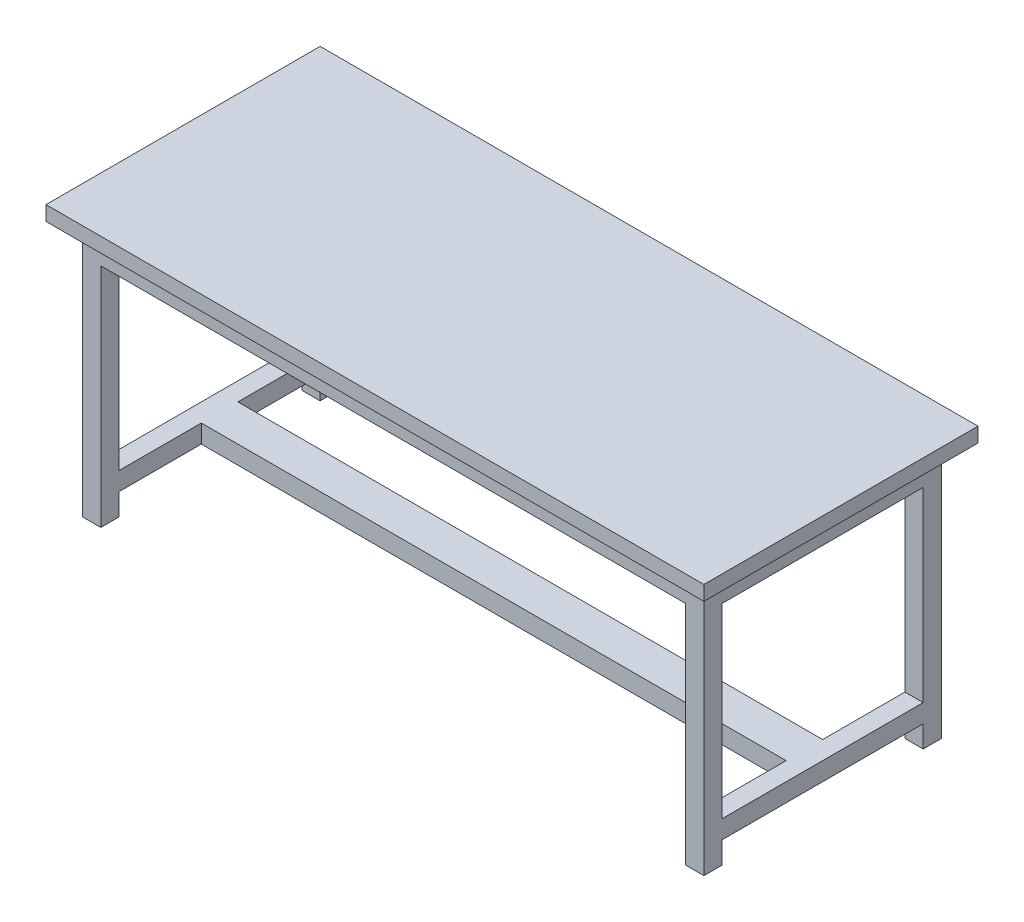
ISO-10303-21;
HEADER;
FILE_DESCRIPTION(('STEP AP214'),'2;1');
FILE_NAME('part.step','',(''),(''),'','','');
FILE_SCHEMA(('AUTOMOTIVE_DESIGN { 1 0 10303 214 1 1 1 1 }'));
ENDSEC;
DATA;
#1=APPLICATION_CONTEXT('core data for automotive mechanical design processes');
#2=APPLICATION_PROTOCOL_DEFINITION('international standard','automotive_design',2000,#1);
#3=PRODUCT_CONTEXT('',#1,'mechanical');
#4=PRODUCT('Part','Part','',(#3));
#5=PRODUCT_RELATED_PRODUCT_CATEGORY('part','',(#4));
#6=PRODUCT_DEFINITION_FORMATION('','',#4);
#7=PRODUCT_DEFINITION_CONTEXT('part definition',#1,'design');
#8=PRODUCT_DEFINITION('design','',#6,#7);
#9=PRODUCT_DEFINITION_SHAPE('','',#8);
#10=(LENGTH_UNIT() NAMED_UNIT(*) SI_UNIT(.MILLI.,.METRE.));
#11=(NAMED_UNIT(*) PLANE_ANGLE_UNIT() SI_UNIT($,.RADIAN.));
#12=(NAMED_UNIT(*) SI_UNIT($,.STERADIAN.) SOLID_ANGLE_UNIT());
#13=UNCERTAINTY_MEASURE_WITH_UNIT(LENGTH_MEASURE(1.E-05),#10,'distance_accuracy_value','');
#14=(GEOMETRIC_REPRESENTATION_CONTEXT(3) GLOBAL_UNCERTAINTY_ASSIGNED_CONTEXT((#13)) GLOBAL_UNIT_ASSIGNED_CONTEXT((#10,
#11,#12)) REPRESENTATION_CONTEXT('',''));
#15=CARTESIAN_POINT('',(0.,0.,0.));
#16=DIRECTION('',(0.,0.,1.));
#17=DIRECTION('',(1.,0.,0.));
#18=AXIS2_PLACEMENT_3D('',#15,#16,#17);
#19=CARTESIAN_POINT('',(1700.,-700.,-50.));
#20=DIRECTION('',(1.,0.,0.));
#21=DIRECTION('',(0.,0.,-1.));
#22=AXIS2_PLACEMENT_3D('',#19,#20,#21);
#23=PLANE('',#22);
#24=DIRECTION('',(0.,-1.,0.));
#25=VECTOR('',#24,1.);
#26=CARTESIAN_POINT('',(1700.,-590.,-425.));
#27=LINE('',#26,#25);
#28=CARTESIAN_POINT('',(1700.,-590.,-425.));
#29=VERTEX_POINT('',#28);
#30=CARTESIAN_POINT('',(1700.,-640.,-424.999999999898));
#31=VERTEX_POINT('',#30);
#32=EDGE_CURVE('E50',#29,#31,#27,.T.);
#33=ORIENTED_EDGE('',*,*,#32,.F.);
#34=DIRECTION('',(0.,0.,-1.));
#35=VECTOR('',#34,1.);
#36=CARTESIAN_POINT('',(1700.,-590.,500000.));
#37=LINE('',#36,#35);
#38=CARTESIAN_POINT('',(1700.,-590.,-650.));
#39=VERTEX_POINT('',#38);
#40=EDGE_CURVE('E286',#29,#39,#37,.T.);
#41=ORIENTED_EDGE('',*,*,#40,.T.);
#42=DIRECTION('',(0.,1.,0.));
#43=VECTOR('',#42,1.);
#44=CARTESIAN_POINT('',(1700.,-700.,-650.));
#45=LINE('',#44,#43);
#46=CARTESIAN_POINT('',(1700.,-80.,-650.));
#47=VERTEX_POINT('',#46);
#48=EDGE_CURVE('E435',#39,#47,#45,.T.);
#49=ORIENTED_EDGE('',*,*,#48,.T.);
#50=DIRECTION('',(0.,0.,1.));
#51=VECTOR('',#50,1.);
#52=CARTESIAN_POINT('',(1700.,-80.,0.));
#53=LINE('',#52,#51);
#54=CARTESIAN_POINT('',(1700.,-80.,-700.));
#55=VERTEX_POINT('',#54);
#56=EDGE_CURVE('E343',#55,#47,#53,.T.);
#57=ORIENTED_EDGE('',*,*,#56,.F.);
#58=DIRECTION('',(0.,1.,0.));
#59=VECTOR('',#58,1.);
#60=CARTESIAN_POINT('',(1700.,-700.,-700.));
#61=LINE('',#60,#59);
#62=CARTESIAN_POINT('',(1700.,-700.,-700.));
#63=VERTEX_POINT('',#62);
#64=EDGE_CURVE('E432',#63,#55,#61,.T.);
#65=ORIENTED_EDGE('',*,*,#64,.F.);
#66=DIRECTION('',(0.,0.,-1.));
#67=VECTOR('',#66,1.);
#68=CARTESIAN_POINT('',(1700.,-700.,-650.));
#69=LINE('',#68,#67);
#70=CARTESIAN_POINT('',(1700.,-700.,-650.));
#71=VERTEX_POINT('',#70);
#72=EDGE_CURVE('E423',#71,#63,#69,.T.);
#73=ORIENTED_EDGE('',*,*,#72,.F.);
#74=CARTESIAN_POINT('',(1700.,-640.,-650.));
#75=VERTEX_POINT('',#74);
#76=EDGE_CURVE('E436',#71,#75,#45,.T.);
#77=ORIENTED_EDGE('',*,*,#76,.T.);
#78=DIRECTION('',(0.,0.,-1.));
#79=VECTOR('',#78,1.);
#80=CARTESIAN_POINT('',(1700.,-640.,500000.));
#81=LINE('',#80,#79);
#82=EDGE_CURVE('E285',#31,#75,#81,.T.);
#83=ORIENTED_EDGE('',*,*,#82,.F.);
#84=EDGE_LOOP('',(#33,#41,#49,#57,#65,#73,#77,#83));
#85=FACE_BOUND('',#84,.T.);
#86=ADVANCED_FACE('F35',(#85),#23,.F.);
#87=DIRECTION('',(0.,1.,0.));
#88=VECTOR('',#87,1.);
#89=CARTESIAN_POINT('',(1700.,-590.,-325.));
#90=LINE('',#89,#88);
#91=CARTESIAN_POINT('',(1700.,-640.,-325.));
#92=VERTEX_POINT('',#91);
#93=CARTESIAN_POINT('',(1700.,-590.,-325.));
#94=VERTEX_POINT('',#93);
#95=EDGE_CURVE('E273',#92,#94,#90,.T.);
#96=ORIENTED_EDGE('',*,*,#95,.F.);
#97=CARTESIAN_POINT('',(1700.,-640.,-100.));
#98=VERTEX_POINT('',#97);
#99=EDGE_CURVE('E288',#98,#92,#81,.T.);
#100=ORIENTED_EDGE('',*,*,#99,.F.);
#101=DIRECTION('',(0.,1.,0.));
#102=VECTOR('',#101,1.);
#103=CARTESIAN_POINT('',(1700.,-700.,-100.));
#104=LINE('',#103,#102);
#105=CARTESIAN_POINT('',(1700.,-700.,-100.));
#106=VERTEX_POINT('',#105);
#107=EDGE_CURVE('E463',#106,#98,#104,.T.);
#108=ORIENTED_EDGE('',*,*,#107,.F.);
#109=DIRECTION('',(0.,0.,-1.));
#110=VECTOR('',#109,1.);
#111=CARTESIAN_POINT('',(1700.,-700.,-50.));
#112=LINE('',#111,#110);
#113=CARTESIAN_POINT('',(1700.,-700.,-50.));
#114=VERTEX_POINT('',#113);
#115=EDGE_CURVE('E450',#114,#106,#112,.T.);
#116=ORIENTED_EDGE('',*,*,#115,.F.);
#117=DIRECTION('',(0.,1.,0.));
#118=VECTOR('',#117,1.);
#119=CARTESIAN_POINT('',(1700.,-700.,-50.));
#120=LINE('',#119,#118);
#121=CARTESIAN_POINT('',(1700.,-80.,-50.));
#122=VERTEX_POINT('',#121);
#123=EDGE_CURVE('E465',#114,#122,#120,.T.);
#124=ORIENTED_EDGE('',*,*,#123,.T.);
#125=DIRECTION('',(0.,0.,1.));
#126=VECTOR('',#125,1.);
#127=CARTESIAN_POINT('',(1700.,-80.,0.));
#128=LINE('',#127,#126);
#129=CARTESIAN_POINT('',(1700.,-80.,-100.));
#130=VERTEX_POINT('',#129);
#131=EDGE_CURVE('E327',#130,#122,#128,.T.);
#132=ORIENTED_EDGE('',*,*,#131,.F.);
#133=CARTESIAN_POINT('',(1700.,-590.,-99.9999999999091));
#134=VERTEX_POINT('',#133);
#135=EDGE_CURVE('E283',#134,#130,#104,.T.);
#136=ORIENTED_EDGE('',*,*,#135,.F.);
#137=EDGE_CURVE('E264',#134,#94,#37,.T.);
#138=ORIENTED_EDGE('',*,*,#137,.T.);
#139=EDGE_LOOP('',(#96,#100,#108,#116,#124,#132,#136,#138));
#140=FACE_BOUND('',#139,.T.);
#141=ADVANCED_FACE('F281',(#140),#23,.F.);
#142=CARTESIAN_POINT('',(100.,-700.,-50.));
#143=DIRECTION('',(-1.,0.,0.));
#144=DIRECTION('',(0.,0.,1.));
#145=AXIS2_PLACEMENT_3D('',#142,#143,#144);
#146=PLANE('',#145);
#147=DIRECTION('',(0.,-1.,0.));
#148=VECTOR('',#147,1.);
#149=CARTESIAN_POINT('',(100.000000000023,-590.,-425.));
#150=LINE('',#149,#148);
#151=CARTESIAN_POINT('',(100.,-590.,-424.999999999898));
#152=VERTEX_POINT('',#151);
#153=CARTESIAN_POINT('',(100.000000000023,-640.,-425.));
#154=VERTEX_POINT('',#153);
#155=EDGE_CURVE('E585',#152,#154,#150,.T.);
#156=ORIENTED_EDGE('',*,*,#155,.T.);
#157=DIRECTION('',(0.,0.,-1.));
#158=VECTOR('',#157,1.);
#159=CARTESIAN_POINT('',(100.,-640.,500000.));
#160=LINE('',#159,#158);
#161=CARTESIAN_POINT('',(100.,-640.,-650.));
#162=VERTEX_POINT('',#161);
#163=EDGE_CURVE('E621',#154,#162,#160,.T.);
#164=ORIENTED_EDGE('',*,*,#163,.T.);
#165=DIRECTION('',(0.,1.,0.));
#166=VECTOR('',#165,1.);
#167=CARTESIAN_POINT('',(100.,-700.,-650.));
#168=LINE('',#167,#166);
#169=CARTESIAN_POINT('',(100.,-700.,-650.));
#170=VERTEX_POINT('',#169);
#171=EDGE_CURVE('E387',#170,#162,#168,.T.);
#172=ORIENTED_EDGE('',*,*,#171,.F.);
#173=DIRECTION('',(0.,0.,1.));
#174=VECTOR('',#173,1.);
#175=CARTESIAN_POINT('',(100.,-700.,-650.));
#176=LINE('',#175,#174);
#177=CARTESIAN_POINT('',(100.,-700.,-700.));
#178=VERTEX_POINT('',#177);
#179=EDGE_CURVE('E366',#178,#170,#176,.T.);
#180=ORIENTED_EDGE('',*,*,#179,.F.);
#181=DIRECTION('',(0.,1.,0.));
#182=VECTOR('',#181,1.);
#183=CARTESIAN_POINT('',(100.,-700.,-700.));
#184=LINE('',#183,#182);
#185=CARTESIAN_POINT('',(100.,-80.,-700.));
#186=VERTEX_POINT('',#185);
#187=EDGE_CURVE('E375',#178,#186,#184,.T.);
#188=ORIENTED_EDGE('',*,*,#187,.T.);
#189=DIRECTION('',(0.,0.,-1.));
#190=VECTOR('',#189,1.);
#191=CARTESIAN_POINT('',(100.,-80.,0.));
#192=LINE('',#191,#190);
#193=CARTESIAN_POINT('',(100.,-80.,-650.));
#194=VERTEX_POINT('',#193);
#195=EDGE_CURVE('E342',#194,#186,#192,.T.);
#196=ORIENTED_EDGE('',*,*,#195,.F.);
#197=CARTESIAN_POINT('',(100.,-590.,-650.));
#198=VERTEX_POINT('',#197);
#199=EDGE_CURVE('E386',#198,#194,#168,.T.);
#200=ORIENTED_EDGE('',*,*,#199,.F.);
#201=DIRECTION('',(0.,0.,-1.));
#202=VECTOR('',#201,1.);
#203=CARTESIAN_POINT('',(100.,-590.,500000.));
#204=LINE('',#203,#202);
#205=EDGE_CURVE('E58',#152,#198,#204,.T.);
#206=ORIENTED_EDGE('',*,*,#205,.F.);
#207=EDGE_LOOP('',(#156,#164,#172,#180,#188,#196,#200,#206));
#208=FACE_BOUND('',#207,.T.);
#209=ADVANCED_FACE('F530',(#208),#146,.F.);
#210=DIRECTION('',(0.,1.,0.));
#211=VECTOR('',#210,1.);
#212=CARTESIAN_POINT('',(100.000000000023,-590.,-325.));
#213=LINE('',#212,#211);
#214=CARTESIAN_POINT('',(100.,-640.,-324.999999999875));
#215=VERTEX_POINT('',#214);
#216=CARTESIAN_POINT('',(100.,-590.,-324.999999999875));
#217=VERTEX_POINT('',#216);
#218=EDGE_CURVE('E269',#215,#217,#213,.T.);
#219=ORIENTED_EDGE('',*,*,#218,.T.);
#220=CARTESIAN_POINT('',(100.,-590.,-100.));
#221=VERTEX_POINT('',#220);
#222=EDGE_CURVE('E266',#221,#217,#204,.T.);
#223=ORIENTED_EDGE('',*,*,#222,.F.);
#224=DIRECTION('',(0.,1.,0.));
#225=VECTOR('',#224,1.);
#226=CARTESIAN_POINT('',(100.,-700.,-100.));
#227=LINE('',#226,#225);
#228=CARTESIAN_POINT('',(100.,-80.,-100.));
#229=VERTEX_POINT('',#228);
#230=EDGE_CURVE('E401',#221,#229,#227,.T.);
#231=ORIENTED_EDGE('',*,*,#230,.T.);
#232=DIRECTION('',(0.,0.,-1.));
#233=VECTOR('',#232,1.);
#234=CARTESIAN_POINT('',(100.,-80.,0.));
#235=LINE('',#234,#233);
#236=CARTESIAN_POINT('',(100.,-80.,-50.));
#237=VERTEX_POINT('',#236);
#238=EDGE_CURVE('E328',#237,#229,#235,.T.);
#239=ORIENTED_EDGE('',*,*,#238,.F.);
#240=DIRECTION('',(0.,1.,0.));
#241=VECTOR('',#240,1.);
#242=CARTESIAN_POINT('',(100.,-700.,-50.));
#243=LINE('',#242,#241);
#244=CARTESIAN_POINT('',(100.,-700.,-50.));
#245=VERTEX_POINT('',#244);
#246=EDGE_CURVE('E414',#245,#237,#243,.T.);
#247=ORIENTED_EDGE('',*,*,#246,.F.);
#248=DIRECTION('',(0.,0.,1.));
#249=VECTOR('',#248,1.);
#250=CARTESIAN_POINT('',(100.,-700.,-50.));
#251=LINE('',#250,#249);
#252=CARTESIAN_POINT('',(100.,-700.,-100.));
#253=VERTEX_POINT('',#252);
#254=EDGE_CURVE('E391',#253,#245,#251,.T.);
#255=ORIENTED_EDGE('',*,*,#254,.F.);
#256=CARTESIAN_POINT('',(100.,-640.,-99.9999999999091));
#257=VERTEX_POINT('',#256);
#258=EDGE_CURVE('E404',#253,#257,#227,.T.);
#259=ORIENTED_EDGE('',*,*,#258,.T.);
#260=EDGE_CURVE('E575',#257,#215,#160,.T.);
#261=ORIENTED_EDGE('',*,*,#260,.T.);
#262=EDGE_LOOP('',(#219,#223,#231,#239,#247,#255,#259,#261));
#263=FACE_BOUND('',#262,.T.);
#264=ADVANCED_FACE('F562',(#263),#146,.F.);
#265=CARTESIAN_POINT('',(100.,-700.,-100.));
#266=DIRECTION('',(0.,0.,1.));
#267=DIRECTION('',(1.,0.,0.));
#268=AXIS2_PLACEMENT_3D('',#265,#266,#267);
#269=PLANE('',#268);
#270=DIRECTION('',(-1.,0.,0.));
#271=VECTOR('',#270,1.);
#272=CARTESIAN_POINT('',(100.,-590.,-100.000000000023));
#273=LINE('',#272,#271);
#274=CARTESIAN_POINT('',(50.,-590.,-99.9999999999091));
#275=VERTEX_POINT('',#274);
#276=EDGE_CURVE('E584',#221,#275,#273,.T.);
#277=ORIENTED_EDGE('',*,*,#276,.T.);
#278=DIRECTION('',(0.,1.,0.));
#279=VECTOR('',#278,1.);
#280=CARTESIAN_POINT('',(50.,-700.,-100.));
#281=LINE('',#280,#279);
#282=CARTESIAN_POINT('',(50.,-80.,-100.));
#283=VERTEX_POINT('',#282);
#284=EDGE_CURVE('E407',#275,#283,#281,.T.);
#285=ORIENTED_EDGE('',*,*,#284,.T.);
#286=DIRECTION('',(-1.,0.,0.));
#287=VECTOR('',#286,1.);
#288=CARTESIAN_POINT('',(0.,-80.,-100.));
#289=LINE('',#288,#287);
#290=EDGE_CURVE('E307',#229,#283,#289,.T.);
#291=ORIENTED_EDGE('',*,*,#290,.F.);
#292=ORIENTED_EDGE('',*,*,#230,.F.);
#293=EDGE_LOOP('',(#277,#285,#291,#292));
#294=FACE_BOUND('',#293,.T.);
#295=ADVANCED_FACE('F663',(#294),#269,.F.);
#296=DIRECTION('',(1.,0.,0.));
#297=VECTOR('',#296,1.);
#298=CARTESIAN_POINT('',(100.,-640.,-100.000000000023));
#299=LINE('',#298,#297);
#300=CARTESIAN_POINT('',(50.,-640.,-99.9999999999091));
#301=VERTEX_POINT('',#300);
#302=EDGE_CURVE('E579',#301,#257,#299,.T.);
#303=ORIENTED_EDGE('',*,*,#302,.T.);
#304=ORIENTED_EDGE('',*,*,#258,.F.);
#305=DIRECTION('',(1.,0.,0.));
#306=VECTOR('',#305,1.);
#307=CARTESIAN_POINT('',(100.,-700.,-100.));
#308=LINE('',#307,#306);
#309=CARTESIAN_POINT('',(50.,-700.,-100.));
#310=VERTEX_POINT('',#309);
#311=EDGE_CURVE('E399',#310,#253,#308,.T.);
#312=ORIENTED_EDGE('',*,*,#311,.F.);
#313=EDGE_CURVE('E408',#310,#301,#281,.T.);
#314=ORIENTED_EDGE('',*,*,#313,.T.);
#315=EDGE_LOOP('',(#303,#304,#312,#314));
#316=FACE_BOUND('',#315,.T.);
#317=ADVANCED_FACE('F578',(#316),#269,.F.);
#318=CARTESIAN_POINT('',(100.,-700.,-650.));
#319=DIRECTION('',(0.,0.,-1.));
#320=DIRECTION('',(-1.,0.,0.));
#321=AXIS2_PLACEMENT_3D('',#318,#319,#320);
#322=PLANE('',#321);
#323=DIRECTION('',(-1.,0.,0.));
#324=VECTOR('',#323,1.);
#325=CARTESIAN_POINT('',(100.,-590.,-650.));
#326=LINE('',#325,#324);
#327=CARTESIAN_POINT('',(50.,-590.,-650.));
#328=VERTEX_POINT('',#327);
#329=EDGE_CURVE('E301',#198,#328,#326,.T.);
#330=ORIENTED_EDGE('',*,*,#329,.F.);
#331=ORIENTED_EDGE('',*,*,#199,.T.);
#332=DIRECTION('',(1.,0.,0.));
#333=VECTOR('',#332,1.);
#334=CARTESIAN_POINT('',(0.,-80.,-650.));
#335=LINE('',#334,#333);
#336=CARTESIAN_POINT('',(50.,-80.,-650.));
#337=VERTEX_POINT('',#336);
#338=EDGE_CURVE('E314',#337,#194,#335,.T.);
#339=ORIENTED_EDGE('',*,*,#338,.F.);
#340=DIRECTION('',(0.,1.,0.));
#341=VECTOR('',#340,1.);
#342=CARTESIAN_POINT('',(50.,-700.,-650.));
#343=LINE('',#342,#341);
#344=EDGE_CURVE('E382',#328,#337,#343,.T.);
#345=ORIENTED_EDGE('',*,*,#344,.F.);
#346=EDGE_LOOP('',(#330,#331,#339,#345));
#347=FACE_BOUND('',#346,.T.);
#348=ADVANCED_FACE('F546',(#347),#322,.F.);
#349=DIRECTION('',(1.,0.,0.));
#350=VECTOR('',#349,1.);
#351=CARTESIAN_POINT('',(100.,-640.,-650.));
#352=LINE('',#351,#350);
#353=CARTESIAN_POINT('',(50.,-640.,-650.));
#354=VERTEX_POINT('',#353);
#355=EDGE_CURVE('E611',#354,#162,#352,.T.);
#356=ORIENTED_EDGE('',*,*,#355,.F.);
#357=CARTESIAN_POINT('',(50.,-700.,-650.));
#358=VERTEX_POINT('',#357);
#359=EDGE_CURVE('E383',#358,#354,#343,.T.);
#360=ORIENTED_EDGE('',*,*,#359,.F.);
#361=DIRECTION('',(-1.,0.,0.));
#362=VECTOR('',#361,1.);
#363=CARTESIAN_POINT('',(100.,-700.,-650.));
#364=LINE('',#363,#362);
#365=EDGE_CURVE('E369',#170,#358,#364,.T.);
#366=ORIENTED_EDGE('',*,*,#365,.F.);
#367=ORIENTED_EDGE('',*,*,#171,.T.);
#368=EDGE_LOOP('',(#356,#360,#366,#367));
#369=FACE_BOUND('',#368,.T.);
#370=ADVANCED_FACE('F547',(#369),#322,.F.);
#371=CARTESIAN_POINT('',(1750.,-700.,-100.));
#372=DIRECTION('',(0.,0.,1.));
#373=DIRECTION('',(1.,0.,0.));
#374=AXIS2_PLACEMENT_3D('',#371,#372,#373);
#375=PLANE('',#374);
#376=DIRECTION('',(-1.,0.,0.));
#377=VECTOR('',#376,1.);
#378=CARTESIAN_POINT('',(1750.,-590.,-100.000000000023));
#379=LINE('',#378,#377);
#380=CARTESIAN_POINT('',(1750.,-590.,-100.));
#381=VERTEX_POINT('',#380);
#382=EDGE_CURVE('E297',#381,#134,#379,.T.);
#383=ORIENTED_EDGE('',*,*,#382,.T.);
#384=ORIENTED_EDGE('',*,*,#135,.T.);
#385=DIRECTION('',(-1.,0.,0.));
#386=VECTOR('',#385,1.);
#387=CARTESIAN_POINT('',(0.,-80.,-100.));
#388=LINE('',#387,#386);
#389=CARTESIAN_POINT('',(1750.,-80.,-100.));
#390=VERTEX_POINT('',#389);
#391=EDGE_CURVE('E362',#390,#130,#388,.T.);
#392=ORIENTED_EDGE('',*,*,#391,.F.);
#393=DIRECTION('',(0.,1.,0.));
#394=VECTOR('',#393,1.);
#395=CARTESIAN_POINT('',(1750.,-700.,-100.));
#396=LINE('',#395,#394);
#397=EDGE_CURVE('E454',#381,#390,#396,.T.);
#398=ORIENTED_EDGE('',*,*,#397,.F.);
#399=EDGE_LOOP('',(#383,#384,#392,#398));
#400=FACE_BOUND('',#399,.T.);
#401=ADVANCED_FACE('F708',(#400),#375,.F.);
#402=DIRECTION('',(1.,0.,0.));
#403=VECTOR('',#402,1.);
#404=CARTESIAN_POINT('',(1750.,-640.,-100.000000000023));
#405=LINE('',#404,#403);
#406=CARTESIAN_POINT('',(1750.,-640.,-100.));
#407=VERTEX_POINT('',#406);
#408=EDGE_CURVE('E299',#98,#407,#405,.T.);
#409=ORIENTED_EDGE('',*,*,#408,.T.);
#410=CARTESIAN_POINT('',(1750.,-700.,-100.));
#411=VERTEX_POINT('',#410);
#412=EDGE_CURVE('E460',#411,#407,#396,.T.);
#413=ORIENTED_EDGE('',*,*,#412,.F.);
#414=DIRECTION('',(1.,0.,0.));
#415=VECTOR('',#414,1.);
#416=CARTESIAN_POINT('',(1750.,-700.,-100.));
#417=LINE('',#416,#415);
#418=EDGE_CURVE('E452',#106,#411,#417,.T.);
#419=ORIENTED_EDGE('',*,*,#418,.F.);
#420=ORIENTED_EDGE('',*,*,#107,.T.);
#421=EDGE_LOOP('',(#409,#413,#419,#420));
#422=FACE_BOUND('',#421,.T.);
#423=ADVANCED_FACE('F705',(#422),#375,.F.);
#424=CARTESIAN_POINT('',(1750.,-700.,-650.));
#425=DIRECTION('',(0.,0.,-1.));
#426=DIRECTION('',(-1.,0.,0.));
#427=AXIS2_PLACEMENT_3D('',#424,#425,#426);
#428=PLANE('',#427);
#429=DIRECTION('',(-1.,0.,0.));
#430=VECTOR('',#429,1.);
#431=CARTESIAN_POINT('',(1750.,-590.,-650.));
#432=LINE('',#431,#430);
#433=CARTESIAN_POINT('',(1750.,-590.,-650.));
#434=VERTEX_POINT('',#433);
#435=EDGE_CURVE('E306',#434,#39,#432,.T.);
#436=ORIENTED_EDGE('',*,*,#435,.F.);
#437=DIRECTION('',(0.,1.,0.));
#438=VECTOR('',#437,1.);
#439=CARTESIAN_POINT('',(1750.,-700.,-650.));
#440=LINE('',#439,#438);
#441=CARTESIAN_POINT('',(1750.,-80.,-650.));
#442=VERTEX_POINT('',#441);
#443=EDGE_CURVE('E439',#434,#442,#440,.T.);
#444=ORIENTED_EDGE('',*,*,#443,.T.);
#445=DIRECTION('',(1.,0.,0.));
#446=VECTOR('',#445,1.);
#447=CARTESIAN_POINT('',(0.,-80.,-650.));
#448=LINE('',#447,#446);
#449=EDGE_CURVE('E356',#47,#442,#448,.T.);
#450=ORIENTED_EDGE('',*,*,#449,.F.);
#451=ORIENTED_EDGE('',*,*,#48,.F.);
#452=EDGE_LOOP('',(#436,#444,#450,#451));
#453=FACE_BOUND('',#452,.T.);
#454=ADVANCED_FACE('F601',(#453),#428,.F.);
#455=DIRECTION('',(1.,0.,0.));
#456=VECTOR('',#455,1.);
#457=CARTESIAN_POINT('',(1750.,-640.,-650.));
#458=LINE('',#457,#456);
#459=CARTESIAN_POINT('',(1750.,-640.,-650.));
#460=VERTEX_POINT('',#459);
#461=EDGE_CURVE('E296',#75,#460,#458,.T.);
#462=ORIENTED_EDGE('',*,*,#461,.F.);
#463=ORIENTED_EDGE('',*,*,#76,.F.);
#464=DIRECTION('',(-1.,0.,0.));
#465=VECTOR('',#464,1.);
#466=CARTESIAN_POINT('',(1750.,-700.,-650.));
#467=LINE('',#466,#465);
#468=CARTESIAN_POINT('',(1750.,-700.,-650.));
#469=VERTEX_POINT('',#468);
#470=EDGE_CURVE('E421',#469,#71,#467,.T.);
#471=ORIENTED_EDGE('',*,*,#470,.F.);
#472=EDGE_CURVE('E440',#469,#460,#440,.T.);
#473=ORIENTED_EDGE('',*,*,#472,.T.);
#474=EDGE_LOOP('',(#462,#463,#471,#473));
#475=FACE_BOUND('',#474,.T.);
#476=ADVANCED_FACE('F653',(#475),#428,.F.);
#477=CARTESIAN_POINT('',(0.,0.,0.));
#478=DIRECTION('',(0.,-1.,0.));
#479=DIRECTION('',(0.,0.,-1.));
#480=AXIS2_PLACEMENT_3D('',#477,#478,#479);
#481=PLANE('',#480);
#482=DIRECTION('',(0.,0.,1.));
#483=VECTOR('',#482,1.);
#484=CARTESIAN_POINT('',(0.,0.,0.));
#485=LINE('',#484,#483);
#486=CARTESIAN_POINT('',(0.,0.,-750.));
#487=VERTEX_POINT('',#486);
#488=CARTESIAN_POINT('',(0.,0.,0.));
#489=VERTEX_POINT('',#488);
#490=EDGE_CURVE('E469',#487,#489,#485,.T.);
#491=ORIENTED_EDGE('',*,*,#490,.F.);
#492=DIRECTION('',(-1.,0.,0.));
#493=VECTOR('',#492,1.);
#494=CARTESIAN_POINT('',(0.,0.,-750.));
#495=LINE('',#494,#493);
#496=CARTESIAN_POINT('',(1800.,0.,-750.));
#497=VERTEX_POINT('',#496);
#498=EDGE_CURVE('E474',#497,#487,#495,.T.);
#499=ORIENTED_EDGE('',*,*,#498,.F.);
#500=DIRECTION('',(0.,0.,-1.));
#501=VECTOR('',#500,1.);
#502=CARTESIAN_POINT('',(1800.,0.,0.));
#503=LINE('',#502,#501);
#504=CARTESIAN_POINT('',(1800.,0.,0.));
#505=VERTEX_POINT('',#504);
#506=EDGE_CURVE('E485',#505,#497,#503,.T.);
#507=ORIENTED_EDGE('',*,*,#506,.F.);
#508=DIRECTION('',(1.,0.,0.));
#509=VECTOR('',#508,1.);
#510=CARTESIAN_POINT('',(0.,0.,0.));
#511=LINE('',#510,#509);
#512=EDGE_CURVE('E483',#489,#505,#511,.T.);
#513=ORIENTED_EDGE('',*,*,#512,.F.);
#514=EDGE_LOOP('',(#491,#499,#507,#513));
#515=FACE_BOUND('',#514,.T.);
#516=DIRECTION('',(1.,0.,0.));
#517=VECTOR('',#516,1.);
#518=CARTESIAN_POINT('',(1750.,0.,-700.));
#519=LINE('',#518,#517);
#520=CARTESIAN_POINT('',(50.,0.,-700.));
#521=VERTEX_POINT('',#520);
#522=CARTESIAN_POINT('',(1750.,0.,-700.));
#523=VERTEX_POINT('',#522);
#524=EDGE_CURVE('E417',#521,#523,#519,.T.);
#525=ORIENTED_EDGE('',*,*,#524,.F.);
#526=DIRECTION('',(0.,0.,-1.));
#527=VECTOR('',#526,1.);
#528=CARTESIAN_POINT('',(50.,0.,-50.));
#529=LINE('',#528,#527);
#530=CARTESIAN_POINT('',(50.,0.,-50.));
#531=VERTEX_POINT('',#530);
#532=EDGE_CURVE('E390',#531,#521,#529,.T.);
#533=ORIENTED_EDGE('',*,*,#532,.F.);
#534=DIRECTION('',(-1.,0.,0.));
#535=VECTOR('',#534,1.);
#536=CARTESIAN_POINT('',(1750.,0.,-50.));
#537=LINE('',#536,#535);
#538=CARTESIAN_POINT('',(1750.,0.,-50.));
#539=VERTEX_POINT('',#538);
#540=EDGE_CURVE('E457',#539,#531,#537,.T.);
#541=ORIENTED_EDGE('',*,*,#540,.F.);
#542=DIRECTION('',(0.,0.,1.));
#543=VECTOR('',#542,1.);
#544=CARTESIAN_POINT('',(1750.,0.,-50.));
#545=LINE('',#544,#543);
#546=EDGE_CURVE('E443',#523,#539,#545,.T.);
#547=ORIENTED_EDGE('',*,*,#546,.F.);
#548=EDGE_LOOP('',(#525,#533,#541,#547));
#549=FACE_BOUND('',#548,.T.);
#550=ADVANCED_FACE('F503',(#515,#549),#481,.T.);
#551=DIRECTION('',(-1.,0.,0.));
#552=VECTOR('',#551,1.);
#553=CARTESIAN_POINT('',(0.,-80.,-100.));
#554=LINE('',#553,#552);
#555=EDGE_CURVE('E320',#130,#229,#554,.T.);
#556=ORIENTED_EDGE('',*,*,#555,.T.);
#557=DIRECTION('',(0.,1.,0.));
#558=VECTOR('',#557,1.);
#559=CARTESIAN_POINT('',(100.,-80.,-100.));
#560=LINE('',#559,#558);
#561=CARTESIAN_POINT('',(100.,0.,-100.));
#562=VERTEX_POINT('',#561);
#563=EDGE_CURVE('E311',#229,#562,#560,.T.);
#564=ORIENTED_EDGE('',*,*,#563,.T.);
#565=DIRECTION('',(1.,0.,0.));
#566=VECTOR('',#565,1.);
#567=CARTESIAN_POINT('',(100.,0.,-100.));
#568=LINE('',#567,#566);
#569=CARTESIAN_POINT('',(1700.,0.,-100.));
#570=VERTEX_POINT('',#569);
#571=EDGE_CURVE('E395',#562,#570,#568,.T.);
#572=ORIENTED_EDGE('',*,*,#571,.T.);
#573=DIRECTION('',(0.,1.,0.));
#574=VECTOR('',#573,1.);
#575=CARTESIAN_POINT('',(1700.,-80.,-100.));
#576=LINE('',#575,#574);
#577=EDGE_CURVE('E324',#130,#570,#576,.T.);
#578=ORIENTED_EDGE('',*,*,#577,.F.);
#579=EDGE_LOOP('',(#556,#564,#572,#578));
#580=FACE_BOUND('',#579,.T.);
#581=ADVANCED_FACE('F543',(#580),#269,.F.);
#582=DIRECTION('',(-1.,0.,0.));
#583=VECTOR('',#582,1.);
#584=CARTESIAN_POINT('',(100.,0.,-650.));
#585=LINE('',#584,#583);
#586=CARTESIAN_POINT('',(1700.,0.,-650.));
#587=VERTEX_POINT('',#586);
#588=CARTESIAN_POINT('',(100.,0.,-650.));
#589=VERTEX_POINT('',#588);
#590=EDGE_CURVE('E365',#587,#589,#585,.T.);
#591=ORIENTED_EDGE('',*,*,#590,.T.);
#592=DIRECTION('',(0.,1.,0.));
#593=VECTOR('',#592,1.);
#594=CARTESIAN_POINT('',(100.,-80.,-650.));
#595=LINE('',#594,#593);
#596=EDGE_CURVE('E305',#194,#589,#595,.T.);
#597=ORIENTED_EDGE('',*,*,#596,.F.);
#598=DIRECTION('',(1.,0.,0.));
#599=VECTOR('',#598,1.);
#600=CARTESIAN_POINT('',(0.,-80.,-650.));
#601=LINE('',#600,#599);
#602=EDGE_CURVE('E331',#194,#47,#601,.T.);
#603=ORIENTED_EDGE('',*,*,#602,.T.);
#604=DIRECTION('',(0.,1.,0.));
#605=VECTOR('',#604,1.);
#606=CARTESIAN_POINT('',(1700.,-80.,-650.));
#607=LINE('',#606,#605);
#608=EDGE_CURVE('E339',#47,#587,#607,.T.);
#609=ORIENTED_EDGE('',*,*,#608,.T.);
#610=EDGE_LOOP('',(#591,#597,#603,#609));
#611=FACE_BOUND('',#610,.T.);
#612=ADVANCED_FACE('F534',(#611),#322,.F.);
#613=DIRECTION('',(0.,0.,1.));
#614=VECTOR('',#613,1.);
#615=CARTESIAN_POINT('',(1700.,-80.,0.));
#616=LINE('',#615,#614);
#617=EDGE_CURVE('E346',#47,#130,#616,.T.);
#618=ORIENTED_EDGE('',*,*,#617,.T.);
#619=ORIENTED_EDGE('',*,*,#577,.T.);
#620=DIRECTION('',(0.,0.,-1.));
#621=VECTOR('',#620,1.);
#622=CARTESIAN_POINT('',(1700.,0.,-50.));
#623=LINE('',#622,#621);
#624=EDGE_CURVE('E448',#570,#587,#623,.T.);
#625=ORIENTED_EDGE('',*,*,#624,.T.);
#626=ORIENTED_EDGE('',*,*,#608,.F.);
#627=EDGE_LOOP('',(#618,#619,#625,#626));
#628=FACE_BOUND('',#627,.T.);
#629=ADVANCED_FACE('F525',(#628),#23,.F.);
#630=DIRECTION('',(0.,0.,-1.));
#631=VECTOR('',#630,1.);
#632=CARTESIAN_POINT('',(100.,0.,0.));
#633=LINE('',#632,#631);
#634=EDGE_CURVE('E317',#562,#589,#633,.T.);
#635=ORIENTED_EDGE('',*,*,#634,.T.);
#636=ORIENTED_EDGE('',*,*,#590,.F.);
#637=ORIENTED_EDGE('',*,*,#624,.F.);
#638=ORIENTED_EDGE('',*,*,#571,.F.);
#639=EDGE_LOOP('',(#635,#636,#637,#638));
#640=FACE_BOUND('',#639,.T.);
#641=ADVANCED_FACE('F521',(#640),#481,.T.);
#642=CARTESIAN_POINT('',(0.,40.,0.));
#643=DIRECTION('',(1.,0.,0.));
#644=DIRECTION('',(0.,0.,-1.));
#645=AXIS2_PLACEMENT_3D('',#642,#643,#644);
#646=PLANE('',#645);
#647=ORIENTED_EDGE('',*,*,#490,.T.);
#648=DIRECTION('',(0.,-1.,0.));
#649=VECTOR('',#648,1.);
#650=CARTESIAN_POINT('',(0.,40.,0.));
#651=LINE('',#650,#649);
#652=CARTESIAN_POINT('',(0.,40.,0.));
#653=VERTEX_POINT('',#652);
#654=EDGE_CURVE('E11',#653,#489,#651,.T.);
#655=ORIENTED_EDGE('',*,*,#654,.F.);
#656=DIRECTION('',(0.,0.,1.));
#657=VECTOR('',#656,1.);
#658=CARTESIAN_POINT('',(0.,40.,0.));
#659=LINE('',#658,#657);
#660=CARTESIAN_POINT('',(0.,40.,-750.));
#661=VERTEX_POINT('',#660);
#662=EDGE_CURVE('E470',#661,#653,#659,.T.);
#663=ORIENTED_EDGE('',*,*,#662,.F.);
#664=DIRECTION('',(0.,-1.,0.));
#665=VECTOR('',#664,1.);
#666=CARTESIAN_POINT('',(0.,40.,-750.));
#667=LINE('',#666,#665);
#668=EDGE_CURVE('E480',#661,#487,#667,.T.);
#669=ORIENTED_EDGE('',*,*,#668,.T.);
#670=EDGE_LOOP('',(#647,#655,#663,#669));
#671=FACE_BOUND('',#670,.T.);
#672=ADVANCED_FACE('F37',(#671),#646,.F.);
#673=CARTESIAN_POINT('',(0.,40.,0.));
#674=DIRECTION('',(0.,0.,-1.));
#675=DIRECTION('',(-1.,0.,0.));
#676=AXIS2_PLACEMENT_3D('',#673,#674,#675);
#677=PLANE('',#676);
#678=ORIENTED_EDGE('',*,*,#512,.T.);
#679=DIRECTION('',(0.,-1.,0.));
#680=VECTOR('',#679,1.);
#681=CARTESIAN_POINT('',(1800.,40.,0.));
#682=LINE('',#681,#680);
#683=CARTESIAN_POINT('',(1800.,40.,0.));
#684=VERTEX_POINT('',#683);
#685=EDGE_CURVE('E43',#684,#505,#682,.T.);
#686=ORIENTED_EDGE('',*,*,#685,.F.);
#687=DIRECTION('',(1.,0.,0.));
#688=VECTOR('',#687,1.);
#689=CARTESIAN_POINT('',(0.,40.,0.));
#690=LINE('',#689,#688);
#691=EDGE_CURVE('E473',#653,#684,#690,.T.);
#692=ORIENTED_EDGE('',*,*,#691,.F.);
#693=ORIENTED_EDGE('',*,*,#654,.T.);
#694=EDGE_LOOP('',(#678,#686,#692,#693));
#695=FACE_BOUND('',#694,.T.);
#696=ADVANCED_FACE('F514',(#695),#677,.F.);
#697=CARTESIAN_POINT('',(1800.,40.,0.));
#698=DIRECTION('',(-1.,0.,0.));
#699=DIRECTION('',(0.,0.,1.));
#700=AXIS2_PLACEMENT_3D('',#697,#698,#699);
#701=PLANE('',#700);
#702=ORIENTED_EDGE('',*,*,#506,.T.);
#703=DIRECTION('',(0.,-1.,0.));
#704=VECTOR('',#703,1.);
#705=CARTESIAN_POINT('',(1800.,40.,-750.));
#706=LINE('',#705,#704);
#707=CARTESIAN_POINT('',(1800.,40.,-750.));
#708=VERTEX_POINT('',#707);
#709=EDGE_CURVE('E490',#708,#497,#706,.T.);
#710=ORIENTED_EDGE('',*,*,#709,.F.);
#711=DIRECTION('',(0.,0.,-1.));
#712=VECTOR('',#711,1.);
#713=CARTESIAN_POINT('',(1800.,40.,0.));
#714=LINE('',#713,#712);
#715=EDGE_CURVE('E476',#684,#708,#714,.T.);
#716=ORIENTED_EDGE('',*,*,#715,.F.);
#717=ORIENTED_EDGE('',*,*,#685,.T.);
#718=EDGE_LOOP('',(#702,#710,#716,#717));
#719=FACE_BOUND('',#718,.T.);
#720=ADVANCED_FACE('F497',(#719),#701,.F.);
#721=CARTESIAN_POINT('',(0.,40.,-750.));
#722=DIRECTION('',(0.,0.,1.));
#723=DIRECTION('',(1.,0.,0.));
#724=AXIS2_PLACEMENT_3D('',#721,#722,#723);
#725=PLANE('',#724);
#726=ORIENTED_EDGE('',*,*,#498,.T.);
#727=ORIENTED_EDGE('',*,*,#668,.F.);
#728=DIRECTION('',(-1.,0.,0.));
#729=VECTOR('',#728,1.);
#730=CARTESIAN_POINT('',(0.,40.,-750.));
#731=LINE('',#730,#729);
#732=EDGE_CURVE('E478',#708,#661,#731,.T.);
#733=ORIENTED_EDGE('',*,*,#732,.F.);
#734=ORIENTED_EDGE('',*,*,#709,.T.);
#735=EDGE_LOOP('',(#726,#727,#733,#734));
#736=FACE_BOUND('',#735,.T.);
#737=ADVANCED_FACE('F507',(#736),#725,.F.);
#738=CARTESIAN_POINT('',(0.,40.,0.));
#739=DIRECTION('',(0.,-1.,0.));
#740=DIRECTION('',(0.,0.,-1.));
#741=AXIS2_PLACEMENT_3D('',#738,#739,#740);
#742=PLANE('',#741);
#743=ORIENTED_EDGE('',*,*,#662,.T.);
#744=ORIENTED_EDGE('',*,*,#691,.T.);
#745=ORIENTED_EDGE('',*,*,#715,.T.);
#746=ORIENTED_EDGE('',*,*,#732,.T.);
#747=EDGE_LOOP('',(#743,#744,#745,#746));
#748=FACE_BOUND('',#747,.T.);
#749=ADVANCED_FACE('F513',(#748),#742,.F.);
#750=CARTESIAN_POINT('',(1750.,-700.,-50.));
#751=DIRECTION('',(-1.,0.,0.));
#752=DIRECTION('',(0.,0.,1.));
#753=AXIS2_PLACEMENT_3D('',#750,#751,#752);
#754=PLANE('',#753);
#755=DIRECTION('',(0.,0.,-1.));
#756=VECTOR('',#755,1.);
#757=CARTESIAN_POINT('',(1750.,-590.,500000.));
#758=LINE('',#757,#756);
#759=EDGE_CURVE('E290',#381,#434,#758,.T.);
#760=ORIENTED_EDGE('',*,*,#759,.F.);
#761=ORIENTED_EDGE('',*,*,#397,.T.);
#762=DIRECTION('',(0.,0.,1.));
#763=VECTOR('',#762,1.);
#764=CARTESIAN_POINT('',(1750.,-80.,0.));
#765=LINE('',#764,#763);
#766=EDGE_CURVE('E359',#442,#390,#765,.T.);
#767=ORIENTED_EDGE('',*,*,#766,.F.);
#768=ORIENTED_EDGE('',*,*,#443,.F.);
#769=EDGE_LOOP('',(#760,#761,#767,#768));
#770=FACE_BOUND('',#769,.T.);
#771=ORIENTED_EDGE('',*,*,#546,.T.);
#772=DIRECTION('',(0.,1.,0.));
#773=VECTOR('',#772,1.);
#774=CARTESIAN_POINT('',(1750.,-700.,-50.));
#775=LINE('',#774,#773);
#776=CARTESIAN_POINT('',(1750.,-700.,-50.));
#777=VERTEX_POINT('',#776);
#778=EDGE_CURVE('E467',#777,#539,#775,.T.);
#779=ORIENTED_EDGE('',*,*,#778,.F.);
#780=DIRECTION('',(0.,0.,1.));
#781=VECTOR('',#780,1.);
#782=CARTESIAN_POINT('',(1750.,-700.,-50.));
#783=LINE('',#782,#781);
#784=EDGE_CURVE('E444',#411,#777,#783,.T.);
#785=ORIENTED_EDGE('',*,*,#784,.F.);
#786=ORIENTED_EDGE('',*,*,#412,.T.);
#787=DIRECTION('',(0.,0.,-1.));
#788=VECTOR('',#787,1.);
#789=CARTESIAN_POINT('',(1750.,-640.,500000.));
#790=LINE('',#789,#788);
#791=EDGE_CURVE('E294',#407,#460,#790,.T.);
#792=ORIENTED_EDGE('',*,*,#791,.T.);
#793=ORIENTED_EDGE('',*,*,#472,.F.);
#794=DIRECTION('',(0.,0.,1.));
#795=VECTOR('',#794,1.);
#796=CARTESIAN_POINT('',(1750.,-700.,-650.));
#797=LINE('',#796,#795);
#798=CARTESIAN_POINT('',(1750.,-700.,-700.));
#799=VERTEX_POINT('',#798);
#800=EDGE_CURVE('E418',#799,#469,#797,.T.);
#801=ORIENTED_EDGE('',*,*,#800,.F.);
#802=DIRECTION('',(0.,1.,0.));
#803=VECTOR('',#802,1.);
#804=CARTESIAN_POINT('',(1750.,-700.,-700.));
#805=LINE('',#804,#803);
#806=EDGE_CURVE('E427',#799,#523,#805,.T.);
#807=ORIENTED_EDGE('',*,*,#806,.T.);
#808=EDGE_LOOP('',(#771,#779,#785,#786,#792,#793,#801,#807));
#809=FACE_BOUND('',#808,.T.);
#810=ADVANCED_FACE('F719',(#770,#809),#754,.F.);
#811=CARTESIAN_POINT('',(1750.,-700.,-50.));
#812=DIRECTION('',(0.,0.,-1.));
#813=DIRECTION('',(-1.,0.,0.));
#814=AXIS2_PLACEMENT_3D('',#811,#812,#813);
#815=PLANE('',#814);
#816=ORIENTED_EDGE('',*,*,#540,.T.);
#817=DIRECTION('',(0.,1.,0.));
#818=VECTOR('',#817,1.);
#819=CARTESIAN_POINT('',(50.,-700.,-50.));
#820=LINE('',#819,#818);
#821=CARTESIAN_POINT('',(50.,-700.,-50.));
#822=VERTEX_POINT('',#821);
#823=EDGE_CURVE('E411',#822,#531,#820,.T.);
#824=ORIENTED_EDGE('',*,*,#823,.F.);
#825=DIRECTION('',(-1.,0.,0.));
#826=VECTOR('',#825,1.);
#827=CARTESIAN_POINT('',(100.,-700.,-50.));
#828=LINE('',#827,#826);
#829=EDGE_CURVE('E394',#245,#822,#828,.T.);
#830=ORIENTED_EDGE('',*,*,#829,.F.);
#831=ORIENTED_EDGE('',*,*,#246,.T.);
#832=DIRECTION('',(-1.,0.,0.));
#833=VECTOR('',#832,1.);
#834=CARTESIAN_POINT('',(0.,-80.,-50.));
#835=LINE('',#834,#833);
#836=EDGE_CURVE('E332',#122,#237,#835,.T.);
#837=ORIENTED_EDGE('',*,*,#836,.F.);
#838=ORIENTED_EDGE('',*,*,#123,.F.);
#839=DIRECTION('',(-1.,0.,0.));
#840=VECTOR('',#839,1.);
#841=CARTESIAN_POINT('',(1750.,-700.,-50.));
#842=LINE('',#841,#840);
#843=EDGE_CURVE('E447',#777,#114,#842,.T.);
#844=ORIENTED_EDGE('',*,*,#843,.F.);
#845=ORIENTED_EDGE('',*,*,#778,.T.);
#846=EDGE_LOOP('',(#816,#824,#830,#831,#837,#838,#844,#845));
#847=FACE_BOUND('',#846,.T.);
#848=ADVANCED_FACE('F567',(#847),#815,.F.);
#849=CARTESIAN_POINT('',(0.,-700.,0.));
#850=DIRECTION('',(0.,1.,0.));
#851=DIRECTION('',(0.,0.,1.));
#852=AXIS2_PLACEMENT_3D('',#849,#850,#851);
#853=PLANE('',#852);
#854=ORIENTED_EDGE('',*,*,#784,.T.);
#855=ORIENTED_EDGE('',*,*,#843,.T.);
#856=ORIENTED_EDGE('',*,*,#115,.T.);
#857=ORIENTED_EDGE('',*,*,#418,.T.);
#858=EDGE_LOOP('',(#854,#855,#856,#857));
#859=FACE_BOUND('',#858,.T.);
#860=ADVANCED_FACE('F702',(#859),#853,.F.);
#861=CARTESIAN_POINT('',(1750.,-700.,-700.));
#862=DIRECTION('',(0.,0.,1.));
#863=DIRECTION('',(1.,0.,0.));
#864=AXIS2_PLACEMENT_3D('',#861,#862,#863);
#865=PLANE('',#864);
#866=ORIENTED_EDGE('',*,*,#524,.T.);
#867=ORIENTED_EDGE('',*,*,#806,.F.);
#868=DIRECTION('',(1.,0.,0.));
#869=VECTOR('',#868,1.);
#870=CARTESIAN_POINT('',(1750.,-700.,-700.));
#871=LINE('',#870,#869);
#872=EDGE_CURVE('E425',#63,#799,#871,.T.);
#873=ORIENTED_EDGE('',*,*,#872,.F.);
#874=ORIENTED_EDGE('',*,*,#64,.T.);
#875=DIRECTION('',(1.,0.,0.));
#876=VECTOR('',#875,1.);
#877=CARTESIAN_POINT('',(0.,-80.,-700.));
#878=LINE('',#877,#876);
#879=EDGE_CURVE('E347',#186,#55,#878,.T.);
#880=ORIENTED_EDGE('',*,*,#879,.F.);
#881=ORIENTED_EDGE('',*,*,#187,.F.);
#882=DIRECTION('',(1.,0.,0.));
#883=VECTOR('',#882,1.);
#884=CARTESIAN_POINT('',(100.,-700.,-700.));
#885=LINE('',#884,#883);
#886=CARTESIAN_POINT('',(50.,-700.,-700.));
#887=VERTEX_POINT('',#886);
#888=EDGE_CURVE('E373',#887,#178,#885,.T.);
#889=ORIENTED_EDGE('',*,*,#888,.F.);
#890=DIRECTION('',(0.,1.,0.));
#891=VECTOR('',#890,1.);
#892=CARTESIAN_POINT('',(50.,-700.,-700.));
#893=LINE('',#892,#891);
#894=EDGE_CURVE('E379',#887,#521,#893,.T.);
#895=ORIENTED_EDGE('',*,*,#894,.T.);
#896=EDGE_LOOP('',(#866,#867,#873,#874,#880,#881,#889,#895));
#897=FACE_BOUND('',#896,.T.);
#898=ADVANCED_FACE('F642',(#897),#865,.F.);
#899=CARTESIAN_POINT('',(0.,-700.,0.));
#900=DIRECTION('',(0.,1.,0.));
#901=DIRECTION('',(0.,0.,1.));
#902=AXIS2_PLACEMENT_3D('',#899,#900,#901);
#903=PLANE('',#902);
#904=ORIENTED_EDGE('',*,*,#800,.T.);
#905=ORIENTED_EDGE('',*,*,#470,.T.);
#906=ORIENTED_EDGE('',*,*,#72,.T.);
#907=ORIENTED_EDGE('',*,*,#872,.T.);
#908=EDGE_LOOP('',(#904,#905,#906,#907));
#909=FACE_BOUND('',#908,.T.);
#910=ADVANCED_FACE('F648',(#909),#903,.F.);
#911=CARTESIAN_POINT('',(50.,-700.,-50.));
#912=DIRECTION('',(1.,0.,0.));
#913=DIRECTION('',(0.,0.,-1.));
#914=AXIS2_PLACEMENT_3D('',#911,#912,#913);
#915=PLANE('',#914);
#916=ORIENTED_EDGE('',*,*,#284,.F.);
#917=DIRECTION('',(0.,0.,-1.));
#918=VECTOR('',#917,1.);
#919=CARTESIAN_POINT('',(50.,-590.,500000.));
#920=LINE('',#919,#918);
#921=EDGE_CURVE('E617',#275,#328,#920,.T.);
#922=ORIENTED_EDGE('',*,*,#921,.T.);
#923=ORIENTED_EDGE('',*,*,#344,.T.);
#924=DIRECTION('',(0.,0.,-1.));
#925=VECTOR('',#924,1.);
#926=CARTESIAN_POINT('',(50.,-80.,0.));
#927=LINE('',#926,#925);
#928=EDGE_CURVE('E310',#283,#337,#927,.T.);
#929=ORIENTED_EDGE('',*,*,#928,.F.);
#930=EDGE_LOOP('',(#916,#922,#923,#929));
#931=FACE_BOUND('',#930,.T.);
#932=ORIENTED_EDGE('',*,*,#532,.T.);
#933=ORIENTED_EDGE('',*,*,#894,.F.);
#934=DIRECTION('',(0.,0.,-1.));
#935=VECTOR('',#934,1.);
#936=CARTESIAN_POINT('',(50.,-700.,-650.));
#937=LINE('',#936,#935);
#938=EDGE_CURVE('E371',#358,#887,#937,.T.);
#939=ORIENTED_EDGE('',*,*,#938,.F.);
#940=ORIENTED_EDGE('',*,*,#359,.T.);
#941=DIRECTION('',(0.,0.,-1.));
#942=VECTOR('',#941,1.);
#943=CARTESIAN_POINT('',(50.,-640.,500000.));
#944=LINE('',#943,#942);
#945=EDGE_CURVE('E620',#301,#354,#944,.T.);
#946=ORIENTED_EDGE('',*,*,#945,.F.);
#947=ORIENTED_EDGE('',*,*,#313,.F.);
#948=DIRECTION('',(0.,0.,-1.));
#949=VECTOR('',#948,1.);
#950=CARTESIAN_POINT('',(50.,-700.,-50.));
#951=LINE('',#950,#949);
#952=EDGE_CURVE('E397',#822,#310,#951,.T.);
#953=ORIENTED_EDGE('',*,*,#952,.F.);
#954=ORIENTED_EDGE('',*,*,#823,.T.);
#955=EDGE_LOOP('',(#932,#933,#939,#940,#946,#947,#953,#954));
#956=FACE_BOUND('',#955,.T.);
#957=ADVANCED_FACE('F629',(#931,#956),#915,.F.);
#958=CARTESIAN_POINT('',(0.,-700.,0.));
#959=DIRECTION('',(0.,1.,0.));
#960=DIRECTION('',(0.,0.,1.));
#961=AXIS2_PLACEMENT_3D('',#958,#959,#960);
#962=PLANE('',#961);
#963=ORIENTED_EDGE('',*,*,#254,.T.);
#964=ORIENTED_EDGE('',*,*,#829,.T.);
#965=ORIENTED_EDGE('',*,*,#952,.T.);
#966=ORIENTED_EDGE('',*,*,#311,.T.);
#967=EDGE_LOOP('',(#963,#964,#965,#966));
#968=FACE_BOUND('',#967,.T.);
#969=ADVANCED_FACE('F572',(#968),#962,.F.);
#970=CARTESIAN_POINT('',(0.,-700.,0.));
#971=DIRECTION('',(0.,1.,0.));
#972=DIRECTION('',(0.,0.,1.));
#973=AXIS2_PLACEMENT_3D('',#970,#971,#972);
#974=PLANE('',#973);
#975=ORIENTED_EDGE('',*,*,#179,.T.);
#976=ORIENTED_EDGE('',*,*,#365,.T.);
#977=ORIENTED_EDGE('',*,*,#938,.T.);
#978=ORIENTED_EDGE('',*,*,#888,.T.);
#979=EDGE_LOOP('',(#975,#976,#977,#978));
#980=FACE_BOUND('',#979,.T.);
#981=ADVANCED_FACE('F634',(#980),#974,.F.);
#982=CARTESIAN_POINT('',(0.,-80.,0.));
#983=DIRECTION('',(0.,-1.,0.));
#984=DIRECTION('',(0.,0.,-1.));
#985=AXIS2_PLACEMENT_3D('',#982,#983,#984);
#986=PLANE('',#985);
#987=ORIENTED_EDGE('',*,*,#617,.F.);
#988=ORIENTED_EDGE('',*,*,#449,.T.);
#989=ORIENTED_EDGE('',*,*,#766,.T.);
#990=ORIENTED_EDGE('',*,*,#391,.T.);
#991=EDGE_LOOP('',(#987,#988,#989,#990));
#992=FACE_BOUND('',#991,.T.);
#993=ADVANCED_FACE('F684',(#992),#986,.T.);
#994=CARTESIAN_POINT('',(0.,-80.,0.));
#995=DIRECTION('',(0.,-1.,0.));
#996=DIRECTION('',(0.,0.,-1.));
#997=AXIS2_PLACEMENT_3D('',#994,#995,#996);
#998=PLANE('',#997);
#999=ORIENTED_EDGE('',*,*,#602,.F.);
#1000=ORIENTED_EDGE('',*,*,#195,.T.);
#1001=ORIENTED_EDGE('',*,*,#879,.T.);
#1002=ORIENTED_EDGE('',*,*,#56,.T.);
#1003=EDGE_LOOP('',(#999,#1000,#1001,#1002));
#1004=FACE_BOUND('',#1003,.T.);
#1005=ADVANCED_FACE('F641',(#1004),#998,.T.);
#1006=CARTESIAN_POINT('',(0.,-80.,0.));
#1007=DIRECTION('',(0.,-1.,0.));
#1008=DIRECTION('',(0.,0.,-1.));
#1009=AXIS2_PLACEMENT_3D('',#1006,#1007,#1008);
#1010=PLANE('',#1009);
#1011=ORIENTED_EDGE('',*,*,#555,.F.);
#1012=ORIENTED_EDGE('',*,*,#131,.T.);
#1013=ORIENTED_EDGE('',*,*,#836,.T.);
#1014=ORIENTED_EDGE('',*,*,#238,.T.);
#1015=EDGE_LOOP('',(#1011,#1012,#1013,#1014));
#1016=FACE_BOUND('',#1015,.T.);
#1017=ADVANCED_FACE('F558',(#1016),#1010,.T.);
#1018=CARTESIAN_POINT('',(100.,-80.,0.));
#1019=DIRECTION('',(1.,0.,0.));
#1020=DIRECTION('',(0.,0.,-1.));
#1021=AXIS2_PLACEMENT_3D('',#1018,#1019,#1020);
#1022=PLANE('',#1021);
#1023=ORIENTED_EDGE('',*,*,#634,.F.);
#1024=ORIENTED_EDGE('',*,*,#563,.F.);
#1025=DIRECTION('',(0.,0.,-1.));
#1026=VECTOR('',#1025,1.);
#1027=CARTESIAN_POINT('',(100.,-80.,0.));
#1028=LINE('',#1027,#1026);
#1029=EDGE_CURVE('E302',#229,#194,#1028,.T.);
#1030=ORIENTED_EDGE('',*,*,#1029,.T.);
#1031=ORIENTED_EDGE('',*,*,#596,.T.);
#1032=EDGE_LOOP('',(#1023,#1024,#1030,#1031));
#1033=FACE_BOUND('',#1032,.T.);
#1034=ADVANCED_FACE('F670',(#1033),#1022,.T.);
#1035=CARTESIAN_POINT('',(0.,-80.,0.));
#1036=DIRECTION('',(0.,-1.,0.));
#1037=DIRECTION('',(0.,0.,-1.));
#1038=AXIS2_PLACEMENT_3D('',#1035,#1036,#1037);
#1039=PLANE('',#1038);
#1040=ORIENTED_EDGE('',*,*,#1029,.F.);
#1041=ORIENTED_EDGE('',*,*,#290,.T.);
#1042=ORIENTED_EDGE('',*,*,#928,.T.);
#1043=ORIENTED_EDGE('',*,*,#338,.T.);
#1044=EDGE_LOOP('',(#1040,#1041,#1042,#1043));
#1045=FACE_BOUND('',#1044,.T.);
#1046=ADVANCED_FACE('F667',(#1045),#1039,.T.);
#1047=CARTESIAN_POINT('',(1750.,-590.,500000.));
#1048=DIRECTION('',(0.,-1.,0.));
#1049=DIRECTION('',(0.,0.,-1.));
#1050=AXIS2_PLACEMENT_3D('',#1047,#1048,#1049);
#1051=PLANE('',#1050);
#1052=ORIENTED_EDGE('',*,*,#382,.F.);
#1053=ORIENTED_EDGE('',*,*,#759,.T.);
#1054=ORIENTED_EDGE('',*,*,#435,.T.);
#1055=ORIENTED_EDGE('',*,*,#40,.F.);
#1056=DIRECTION('',(1.,0.,0.));
#1057=VECTOR('',#1056,1.);
#1058=CARTESIAN_POINT('',(-500000.,-590.,-425.));
#1059=LINE('',#1058,#1057);
#1060=EDGE_CURVE('E270',#152,#29,#1059,.T.);
#1061=ORIENTED_EDGE('',*,*,#1060,.F.);
#1062=ORIENTED_EDGE('',*,*,#205,.T.);
#1063=ORIENTED_EDGE('',*,*,#329,.T.);
#1064=ORIENTED_EDGE('',*,*,#921,.F.);
#1065=ORIENTED_EDGE('',*,*,#276,.F.);
#1066=ORIENTED_EDGE('',*,*,#222,.T.);
#1067=DIRECTION('',(1.,0.,0.));
#1068=VECTOR('',#1067,1.);
#1069=CARTESIAN_POINT('',(-500000.,-590.,-325.));
#1070=LINE('',#1069,#1068);
#1071=EDGE_CURVE('E259',#217,#94,#1070,.T.);
#1072=ORIENTED_EDGE('',*,*,#1071,.T.);
#1073=ORIENTED_EDGE('',*,*,#137,.F.);
#1074=EDGE_LOOP('',(#1052,#1053,#1054,#1055,#1061,#1062,#1063,#1064,#1065,#1066,#1072,#1073));
#1075=FACE_BOUND('',#1074,.T.);
#1076=ADVANCED_FACE('F262',(#1075),#1051,.F.);
#1077=CARTESIAN_POINT('',(1750.,-640.,500000.));
#1078=DIRECTION('',(0.,1.,0.));
#1079=DIRECTION('',(0.,0.,1.));
#1080=AXIS2_PLACEMENT_3D('',#1077,#1078,#1079);
#1081=PLANE('',#1080);
#1082=ORIENTED_EDGE('',*,*,#408,.F.);
#1083=ORIENTED_EDGE('',*,*,#99,.T.);
#1084=DIRECTION('',(1.,0.,0.));
#1085=VECTOR('',#1084,1.);
#1086=CARTESIAN_POINT('',(-500000.,-640.,-325.));
#1087=LINE('',#1086,#1085);
#1088=EDGE_CURVE('E276',#215,#92,#1087,.T.);
#1089=ORIENTED_EDGE('',*,*,#1088,.F.);
#1090=ORIENTED_EDGE('',*,*,#260,.F.);
#1091=ORIENTED_EDGE('',*,*,#302,.F.);
#1092=ORIENTED_EDGE('',*,*,#945,.T.);
#1093=ORIENTED_EDGE('',*,*,#355,.T.);
#1094=ORIENTED_EDGE('',*,*,#163,.F.);
#1095=DIRECTION('',(1.,0.,0.));
#1096=VECTOR('',#1095,1.);
#1097=CARTESIAN_POINT('',(-500000.,-640.,-425.));
#1098=LINE('',#1097,#1096);
#1099=EDGE_CURVE('E605',#154,#31,#1098,.T.);
#1100=ORIENTED_EDGE('',*,*,#1099,.T.);
#1101=ORIENTED_EDGE('',*,*,#82,.T.);
#1102=ORIENTED_EDGE('',*,*,#461,.T.);
#1103=ORIENTED_EDGE('',*,*,#791,.F.);
#1104=EDGE_LOOP('',(#1082,#1083,#1089,#1090,#1091,#1092,#1093,#1094,#1100,#1101,#1102,#1103));
#1105=FACE_BOUND('',#1104,.T.);
#1106=ADVANCED_FACE('F627',(#1105),#1081,.F.);
#1107=CARTESIAN_POINT('',(-500000.,-590.,-425.));
#1108=DIRECTION('',(0.,0.,1.));
#1109=DIRECTION('',(1.,0.,0.));
#1110=AXIS2_PLACEMENT_3D('',#1107,#1108,#1109);
#1111=PLANE('',#1110);
#1112=ORIENTED_EDGE('',*,*,#155,.F.);
#1113=ORIENTED_EDGE('',*,*,#1060,.T.);
#1114=ORIENTED_EDGE('',*,*,#32,.T.);
#1115=ORIENTED_EDGE('',*,*,#1099,.F.);
#1116=EDGE_LOOP('',(#1112,#1113,#1114,#1115));
#1117=FACE_BOUND('',#1116,.T.);
#1118=ADVANCED_FACE('F655',(#1117),#1111,.F.);
#1119=CARTESIAN_POINT('',(-500000.,-590.,-325.));
#1120=DIRECTION('',(0.,0.,-1.));
#1121=DIRECTION('',(-1.,0.,0.));
#1122=AXIS2_PLACEMENT_3D('',#1119,#1120,#1121);
#1123=PLANE('',#1122);
#1124=ORIENTED_EDGE('',*,*,#218,.F.);
#1125=ORIENTED_EDGE('',*,*,#1088,.T.);
#1126=ORIENTED_EDGE('',*,*,#95,.T.);
#1127=ORIENTED_EDGE('',*,*,#1071,.F.);
#1128=EDGE_LOOP('',(#1124,#1125,#1126,#1127));
#1129=FACE_BOUND('',#1128,.T.);
#1130=ADVANCED_FACE('F274',(#1129),#1123,.F.);
#1131=CLOSED_SHELL('',(#86,#141,#209,#264,#295,#317,#348,#370,#401,#423,#454,#476,#550,#581,
#612,#629,#641,#672,#696,#720,#737,#749,#810,#848,#860,#898,#910,#957,#969,#981,#993,#1005,
#1017,#1034,#1046,#1076,#1106,#1118,#1130));
#1132=MANIFOLD_SOLID_BREP('B2',#1131);
#1133=ADVANCED_BREP_SHAPE_REPRESENTATION('',(#18,#1132),#14);
#1134=SHAPE_DEFINITION_REPRESENTATION(#9,#1133);
ENDSEC;
END-ISO-10303-21;
